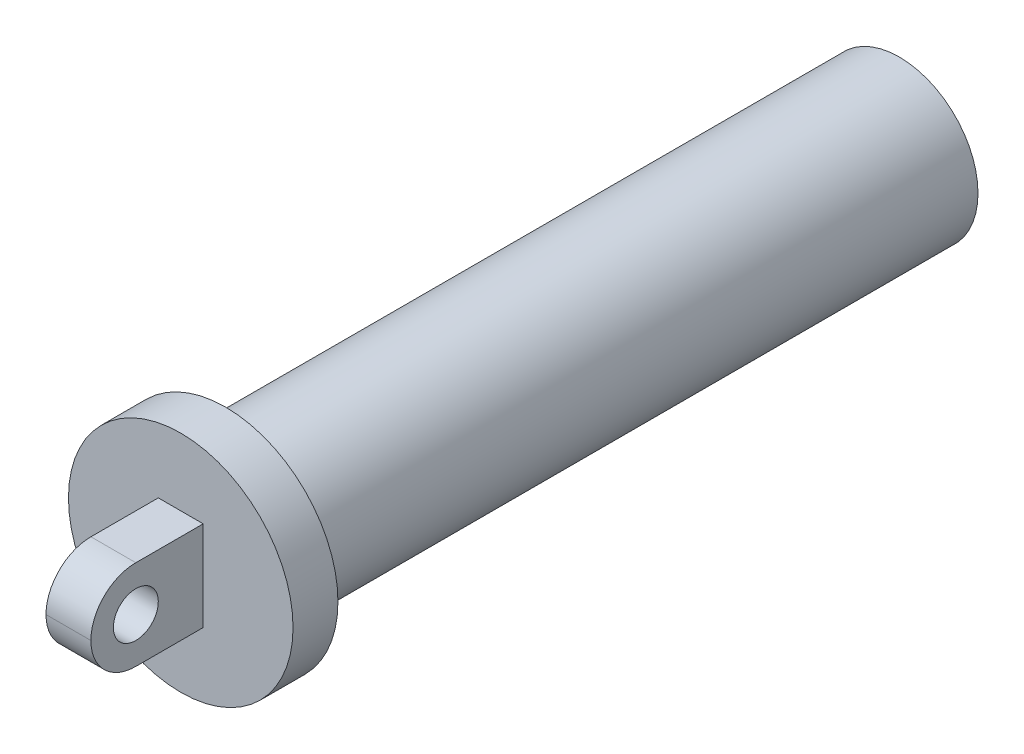
ISO-10303-21;
HEADER;
FILE_DESCRIPTION(('STEP AP214'),'2;1');
FILE_NAME('part.step','',(''),(''),'','','');
FILE_SCHEMA(('AUTOMOTIVE_DESIGN { 1 0 10303 214 1 1 1 1 }'));
ENDSEC;
DATA;
#1=APPLICATION_CONTEXT('core data for automotive mechanical design processes');
#2=APPLICATION_PROTOCOL_DEFINITION('international standard','automotive_design',2000,#1);
#3=PRODUCT_CONTEXT('',#1,'mechanical');
#4=PRODUCT('Part','Part','',(#3));
#5=PRODUCT_RELATED_PRODUCT_CATEGORY('part','',(#4));
#6=PRODUCT_DEFINITION_FORMATION('','',#4);
#7=PRODUCT_DEFINITION_CONTEXT('part definition',#1,'design');
#8=PRODUCT_DEFINITION('design','',#6,#7);
#9=PRODUCT_DEFINITION_SHAPE('','',#8);
#10=(LENGTH_UNIT() NAMED_UNIT(*) SI_UNIT(.MILLI.,.METRE.));
#11=(NAMED_UNIT(*) PLANE_ANGLE_UNIT() SI_UNIT($,.RADIAN.));
#12=(NAMED_UNIT(*) SI_UNIT($,.STERADIAN.) SOLID_ANGLE_UNIT());
#13=UNCERTAINTY_MEASURE_WITH_UNIT(LENGTH_MEASURE(1.E-05),#10,'distance_accuracy_value','');
#14=(GEOMETRIC_REPRESENTATION_CONTEXT(3) GLOBAL_UNCERTAINTY_ASSIGNED_CONTEXT((#13)) GLOBAL_UNIT_ASSIGNED_CONTEXT((#10,
#11,#12)) REPRESENTATION_CONTEXT('',''));
#15=CARTESIAN_POINT('',(0.,0.,0.));
#16=DIRECTION('',(0.,0.,1.));
#17=DIRECTION('',(1.,0.,0.));
#18=AXIS2_PLACEMENT_3D('',#15,#16,#17);
#19=CARTESIAN_POINT('',(0.,0.,10.));
#20=DIRECTION('',(0.,0.,-1.));
#21=DIRECTION('',(-1.,0.,0.));
#22=AXIS2_PLACEMENT_3D('',#19,#20,#21);
#23=CYLINDRICAL_SURFACE('',#22,25.);
#24=CARTESIAN_POINT('',(0.,0.,10.));
#25=DIRECTION('',(0.,0.,1.));
#26=DIRECTION('',(1.,0.,0.));
#27=AXIS2_PLACEMENT_3D('',#24,#25,#26);
#28=CIRCLE('',#27,25.);
#29=CARTESIAN_POINT('',(25.,0.,10.));
#30=VERTEX_POINT('',#29);
#31=EDGE_CURVE('E130',#30,#30,#28,.T.);
#32=ORIENTED_EDGE('',*,*,#31,.F.);
#33=EDGE_LOOP('',(#32));
#34=FACE_BOUND('',#33,.T.);
#35=CARTESIAN_POINT('',(0.,0.,0.));
#36=DIRECTION('',(0.,0.,1.));
#37=DIRECTION('',(1.,0.,0.));
#38=AXIS2_PLACEMENT_3D('',#35,#36,#37);
#39=CIRCLE('',#38,25.);
#40=CARTESIAN_POINT('',(25.,0.,0.));
#41=VERTEX_POINT('',#40);
#42=EDGE_CURVE('E129',#41,#41,#39,.T.);
#43=ORIENTED_EDGE('',*,*,#42,.T.);
#44=EDGE_LOOP('',(#43));
#45=FACE_BOUND('',#44,.T.);
#46=ADVANCED_FACE('F43',(#34,#45),#23,.T.);
#47=CARTESIAN_POINT('',(0.,0.,10.));
#48=DIRECTION('',(0.,0.,1.));
#49=DIRECTION('',(1.,0.,0.));
#50=AXIS2_PLACEMENT_3D('',#47,#48,#49);
#51=PLANE('',#50);
#52=DIRECTION('',(0.,1.,0.));
#53=VECTOR('',#52,1.);
#54=CARTESIAN_POINT('',(5.,10.,10.));
#55=LINE('',#54,#53);
#56=CARTESIAN_POINT('',(5.,-10.,10.));
#57=VERTEX_POINT('',#56);
#58=CARTESIAN_POINT('',(5.,10.,10.));
#59=VERTEX_POINT('',#58);
#60=EDGE_CURVE('E113',#57,#59,#55,.T.);
#61=ORIENTED_EDGE('',*,*,#60,.F.);
#62=DIRECTION('',(1.,0.,0.));
#63=VECTOR('',#62,1.);
#64=CARTESIAN_POINT('',(-5.,-10.,10.));
#65=LINE('',#64,#63);
#66=CARTESIAN_POINT('',(-5.,-10.,10.));
#67=VERTEX_POINT('',#66);
#68=EDGE_CURVE('E107',#67,#57,#65,.T.);
#69=ORIENTED_EDGE('',*,*,#68,.F.);
#70=DIRECTION('',(0.,-1.,0.));
#71=VECTOR('',#70,1.);
#72=CARTESIAN_POINT('',(-5.,10.,10.));
#73=LINE('',#72,#71);
#74=CARTESIAN_POINT('',(-5.,10.,10.));
#75=VERTEX_POINT('',#74);
#76=EDGE_CURVE('E90',#75,#67,#73,.T.);
#77=ORIENTED_EDGE('',*,*,#76,.F.);
#78=DIRECTION('',(-1.,0.,0.));
#79=VECTOR('',#78,1.);
#80=CARTESIAN_POINT('',(-5.,10.,10.));
#81=LINE('',#80,#79);
#82=EDGE_CURVE('E104',#59,#75,#81,.T.);
#83=ORIENTED_EDGE('',*,*,#82,.F.);
#84=EDGE_LOOP('',(#61,#69,#77,#83));
#85=FACE_BOUND('',#84,.T.);
#86=ORIENTED_EDGE('',*,*,#31,.T.);
#87=EDGE_LOOP('',(#86));
#88=FACE_BOUND('',#87,.T.);
#89=ADVANCED_FACE('F102',(#85,#88),#51,.T.);
#90=CARTESIAN_POINT('',(0.,0.,0.));
#91=DIRECTION('',(0.,0.,1.));
#92=DIRECTION('',(1.,0.,0.));
#93=AXIS2_PLACEMENT_3D('',#90,#91,#92);
#94=PLANE('',#93);
#95=CARTESIAN_POINT('',(0.,0.,0.));
#96=DIRECTION('',(0.,0.,1.));
#97=DIRECTION('',(1.,0.,0.));
#98=AXIS2_PLACEMENT_3D('',#95,#96,#97);
#99=CIRCLE('',#98,17.5);
#100=CARTESIAN_POINT('',(17.5,0.,0.));
#101=VERTEX_POINT('',#100);
#102=EDGE_CURVE('E11',#101,#101,#99,.F.);
#103=ORIENTED_EDGE('',*,*,#102,.F.);
#104=EDGE_LOOP('',(#103));
#105=FACE_BOUND('',#104,.T.);
#106=ORIENTED_EDGE('',*,*,#42,.F.);
#107=EDGE_LOOP('',(#106));
#108=FACE_BOUND('',#107,.T.);
#109=ADVANCED_FACE('F201',(#105,#108),#94,.F.);
#110=CARTESIAN_POINT('',(5.,10.,35.));
#111=DIRECTION('',(-1.,0.,0.));
#112=DIRECTION('',(0.,-1.,0.));
#113=AXIS2_PLACEMENT_3D('',#110,#111,#112);
#114=PLANE('',#113);
#115=CARTESIAN_POINT('',(5.,0.,25.));
#116=DIRECTION('',(-1.,0.,0.));
#117=DIRECTION('',(0.,-1.,0.));
#118=AXIS2_PLACEMENT_3D('',#115,#116,#117);
#119=CIRCLE('',#118,5.);
#120=CARTESIAN_POINT('',(5.,-4.99999999999999,25.));
#121=VERTEX_POINT('',#120);
#122=EDGE_CURVE('E116',#121,#121,#119,.T.);
#123=ORIENTED_EDGE('',*,*,#122,.T.);
#124=EDGE_LOOP('',(#123));
#125=FACE_BOUND('',#124,.T.);
#126=CARTESIAN_POINT('',(5.,0.,25.));
#127=DIRECTION('',(-1.,0.,0.));
#128=DIRECTION('',(0.,-1.,0.));
#129=AXIS2_PLACEMENT_3D('',#126,#127,#128);
#130=CIRCLE('',#129,10.);
#131=CARTESIAN_POINT('',(5.,10.,25.));
#132=VERTEX_POINT('',#131);
#133=CARTESIAN_POINT('',(5.,0.,35.));
#134=VERTEX_POINT('',#133);
#135=EDGE_CURVE('E134',#132,#134,#130,.F.);
#136=ORIENTED_EDGE('',*,*,#135,.T.);
#137=CARTESIAN_POINT('',(5.,0.,25.));
#138=DIRECTION('',(-1.,0.,0.));
#139=DIRECTION('',(0.,-1.,0.));
#140=AXIS2_PLACEMENT_3D('',#137,#138,#139);
#141=CIRCLE('',#140,10.);
#142=CARTESIAN_POINT('',(5.,-10.,25.));
#143=VERTEX_POINT('',#142);
#144=EDGE_CURVE('E140',#134,#143,#141,.F.);
#145=ORIENTED_EDGE('',*,*,#144,.T.);
#146=DIRECTION('',(0.,0.,-1.));
#147=VECTOR('',#146,1.);
#148=CARTESIAN_POINT('',(5.,-10.,35.));
#149=LINE('',#148,#147);
#150=EDGE_CURVE('E122',#143,#57,#149,.T.);
#151=ORIENTED_EDGE('',*,*,#150,.T.);
#152=ORIENTED_EDGE('',*,*,#60,.T.);
#153=DIRECTION('',(0.,0.,-1.));
#154=VECTOR('',#153,1.);
#155=CARTESIAN_POINT('',(5.,10.,35.));
#156=LINE('',#155,#154);
#157=EDGE_CURVE('E95',#132,#59,#156,.T.);
#158=ORIENTED_EDGE('',*,*,#157,.F.);
#159=EDGE_LOOP('',(#136,#145,#151,#152,#158));
#160=FACE_BOUND('',#159,.T.);
#161=ADVANCED_FACE('F178',(#125,#160),#114,.F.);
#162=CARTESIAN_POINT('',(-5.,10.,35.));
#163=DIRECTION('',(0.,-1.,0.));
#164=DIRECTION('',(0.,0.,-1.));
#165=AXIS2_PLACEMENT_3D('',#162,#163,#164);
#166=PLANE('',#165);
#167=DIRECTION('',(0.,0.,-1.));
#168=VECTOR('',#167,1.);
#169=CARTESIAN_POINT('',(-5.,10.,35.));
#170=LINE('',#169,#168);
#171=CARTESIAN_POINT('',(-5.,10.,25.));
#172=VERTEX_POINT('',#171);
#173=EDGE_CURVE('E87',#172,#75,#170,.T.);
#174=ORIENTED_EDGE('',*,*,#173,.F.);
#175=DIRECTION('',(-1.,0.,0.));
#176=VECTOR('',#175,1.);
#177=CARTESIAN_POINT('',(5.,10.,25.));
#178=LINE('',#177,#176);
#179=EDGE_CURVE('E52',#172,#132,#178,.F.);
#180=ORIENTED_EDGE('',*,*,#179,.T.);
#181=ORIENTED_EDGE('',*,*,#157,.T.);
#182=ORIENTED_EDGE('',*,*,#82,.T.);
#183=EDGE_LOOP('',(#174,#180,#181,#182));
#184=FACE_BOUND('',#183,.T.);
#185=ADVANCED_FACE('F110',(#184),#166,.F.);
#186=CARTESIAN_POINT('',(-5.,10.,35.));
#187=DIRECTION('',(1.,0.,0.));
#188=DIRECTION('',(0.,1.,0.));
#189=AXIS2_PLACEMENT_3D('',#186,#187,#188);
#190=PLANE('',#189);
#191=CARTESIAN_POINT('',(-5.,0.,25.));
#192=DIRECTION('',(-1.,0.,0.));
#193=DIRECTION('',(0.,-1.,0.));
#194=AXIS2_PLACEMENT_3D('',#191,#192,#193);
#195=CIRCLE('',#194,5.);
#196=CARTESIAN_POINT('',(-5.,-5.,25.));
#197=VERTEX_POINT('',#196);
#198=EDGE_CURVE('E155',#197,#197,#195,.T.);
#199=ORIENTED_EDGE('',*,*,#198,.F.);
#200=EDGE_LOOP('',(#199));
#201=FACE_BOUND('',#200,.T.);
#202=DIRECTION('',(0.,0.,-1.));
#203=VECTOR('',#202,1.);
#204=CARTESIAN_POINT('',(-5.,-10.,35.));
#205=LINE('',#204,#203);
#206=CARTESIAN_POINT('',(-5.,-10.,25.));
#207=VERTEX_POINT('',#206);
#208=EDGE_CURVE('E96',#207,#67,#205,.T.);
#209=ORIENTED_EDGE('',*,*,#208,.F.);
#210=CARTESIAN_POINT('',(-5.,0.,25.));
#211=DIRECTION('',(1.,0.,0.));
#212=DIRECTION('',(0.,1.,0.));
#213=AXIS2_PLACEMENT_3D('',#210,#211,#212);
#214=CIRCLE('',#213,10.);
#215=CARTESIAN_POINT('',(-5.,0.,35.));
#216=VERTEX_POINT('',#215);
#217=EDGE_CURVE('E64',#207,#216,#214,.F.);
#218=ORIENTED_EDGE('',*,*,#217,.T.);
#219=CARTESIAN_POINT('',(-5.,0.,25.));
#220=DIRECTION('',(1.,0.,0.));
#221=DIRECTION('',(0.,1.,0.));
#222=AXIS2_PLACEMENT_3D('',#219,#220,#221);
#223=CIRCLE('',#222,10.);
#224=EDGE_CURVE('E59',#216,#172,#223,.F.);
#225=ORIENTED_EDGE('',*,*,#224,.T.);
#226=ORIENTED_EDGE('',*,*,#173,.T.);
#227=ORIENTED_EDGE('',*,*,#76,.T.);
#228=EDGE_LOOP('',(#209,#218,#225,#226,#227));
#229=FACE_BOUND('',#228,.T.);
#230=ADVANCED_FACE('F89',(#201,#229),#190,.F.);
#231=CARTESIAN_POINT('',(-5.,-10.,35.));
#232=DIRECTION('',(0.,1.,0.));
#233=DIRECTION('',(0.,0.,1.));
#234=AXIS2_PLACEMENT_3D('',#231,#232,#233);
#235=PLANE('',#234);
#236=ORIENTED_EDGE('',*,*,#150,.F.);
#237=DIRECTION('',(1.,0.,0.));
#238=VECTOR('',#237,1.);
#239=CARTESIAN_POINT('',(-5.,-10.,25.));
#240=LINE('',#239,#238);
#241=EDGE_CURVE('E143',#143,#207,#240,.F.);
#242=ORIENTED_EDGE('',*,*,#241,.T.);
#243=ORIENTED_EDGE('',*,*,#208,.T.);
#244=ORIENTED_EDGE('',*,*,#68,.T.);
#245=EDGE_LOOP('',(#236,#242,#243,#244));
#246=FACE_BOUND('',#245,.T.);
#247=ADVANCED_FACE('F183',(#246),#235,.F.);
#248=CARTESIAN_POINT('',(15.,0.,25.));
#249=DIRECTION('',(-1.,0.,0.));
#250=DIRECTION('',(0.,-1.,0.));
#251=AXIS2_PLACEMENT_3D('',#248,#249,#250);
#252=CYLINDRICAL_SURFACE('',#251,5.);
#253=ORIENTED_EDGE('',*,*,#198,.T.);
#254=EDGE_LOOP('',(#253));
#255=FACE_BOUND('',#254,.T.);
#256=ORIENTED_EDGE('',*,*,#122,.F.);
#257=EDGE_LOOP('',(#256));
#258=FACE_BOUND('',#257,.T.);
#259=ADVANCED_FACE('F181',(#255,#258),#252,.F.);
#260=CARTESIAN_POINT('',(0.,0.,25.));
#261=DIRECTION('',(1.,0.,0.));
#262=DIRECTION('',(0.,0.,-1.));
#263=AXIS2_PLACEMENT_3D('',#260,#261,#262);
#264=CYLINDRICAL_SURFACE('',#263,10.);
#265=ORIENTED_EDGE('',*,*,#179,.F.);
#266=ORIENTED_EDGE('',*,*,#224,.F.);
#267=DIRECTION('',(-1.,0.,0.));
#268=VECTOR('',#267,1.);
#269=CARTESIAN_POINT('',(-5.,0.,35.));
#270=LINE('',#269,#268);
#271=EDGE_CURVE('E152',#134,#216,#270,.T.);
#272=ORIENTED_EDGE('',*,*,#271,.F.);
#273=ORIENTED_EDGE('',*,*,#135,.F.);
#274=EDGE_LOOP('',(#265,#266,#272,#273));
#275=FACE_BOUND('',#274,.T.);
#276=ADVANCED_FACE('F45',(#275),#264,.T.);
#277=CARTESIAN_POINT('',(0.,0.,25.));
#278=DIRECTION('',(-1.,0.,0.));
#279=DIRECTION('',(0.,0.,1.));
#280=AXIS2_PLACEMENT_3D('',#277,#278,#279);
#281=CYLINDRICAL_SURFACE('',#280,10.);
#282=ORIENTED_EDGE('',*,*,#217,.F.);
#283=ORIENTED_EDGE('',*,*,#241,.F.);
#284=ORIENTED_EDGE('',*,*,#144,.F.);
#285=ORIENTED_EDGE('',*,*,#271,.T.);
#286=EDGE_LOOP('',(#282,#283,#284,#285));
#287=FACE_BOUND('',#286,.T.);
#288=ADVANCED_FACE('F190',(#287),#281,.T.);
#289=CARTESIAN_POINT('',(0.,0.,-150.));
#290=DIRECTION('',(0.,0.,-1.));
#291=DIRECTION('',(-1.,0.,0.));
#292=AXIS2_PLACEMENT_3D('',#289,#290,#291);
#293=PLANE('',#292);
#294=CARTESIAN_POINT('',(0.,0.,-150.));
#295=DIRECTION('',(0.,0.,-1.));
#296=DIRECTION('',(-1.,0.,0.));
#297=AXIS2_PLACEMENT_3D('',#294,#295,#296);
#298=CIRCLE('',#297,17.5);
#299=CARTESIAN_POINT('',(-17.5,0.,-150.));
#300=VERTEX_POINT('',#299);
#301=EDGE_CURVE('E156',#300,#300,#298,.T.);
#302=ORIENTED_EDGE('',*,*,#301,.T.);
#303=EDGE_LOOP('',(#302));
#304=FACE_BOUND('',#303,.T.);
#305=CARTESIAN_POINT('',(0.,0.,-150.));
#306=DIRECTION('',(0.,0.,-1.));
#307=DIRECTION('',(-1.,0.,0.));
#308=AXIS2_PLACEMENT_3D('',#305,#306,#307);
#309=CIRCLE('',#308,12.5);
#310=CARTESIAN_POINT('',(-12.5,0.,-150.));
#311=VERTEX_POINT('',#310);
#312=EDGE_CURVE('E165',#311,#311,#309,.T.);
#313=ORIENTED_EDGE('',*,*,#312,.F.);
#314=EDGE_LOOP('',(#313));
#315=FACE_BOUND('',#314,.T.);
#316=ADVANCED_FACE('F207',(#304,#315),#293,.T.);
#317=CARTESIAN_POINT('',(0.,0.,-150.));
#318=DIRECTION('',(0.,0.,1.));
#319=DIRECTION('',(1.,0.,0.));
#320=AXIS2_PLACEMENT_3D('',#317,#318,#319);
#321=CYLINDRICAL_SURFACE('',#320,17.5);
#322=ORIENTED_EDGE('',*,*,#301,.F.);
#323=EDGE_LOOP('',(#322));
#324=FACE_BOUND('',#323,.T.);
#325=ORIENTED_EDGE('',*,*,#102,.T.);
#326=EDGE_LOOP('',(#325));
#327=FACE_BOUND('',#326,.T.);
#328=ADVANCED_FACE('F211',(#324,#327),#321,.T.);
#329=CARTESIAN_POINT('',(0.,0.,-150.));
#330=DIRECTION('',(0.,0.,1.));
#331=DIRECTION('',(1.,0.,0.));
#332=AXIS2_PLACEMENT_3D('',#329,#330,#331);
#333=CYLINDRICAL_SURFACE('',#332,12.5);
#334=ORIENTED_EDGE('',*,*,#312,.T.);
#335=EDGE_LOOP('',(#334));
#336=FACE_BOUND('',#335,.T.);
#337=CARTESIAN_POINT('',(0.,0.,0.));
#338=DIRECTION('',(0.,0.,-1.));
#339=DIRECTION('',(-1.,0.,0.));
#340=AXIS2_PLACEMENT_3D('',#337,#338,#339);
#341=CIRCLE('',#340,12.5);
#342=CARTESIAN_POINT('',(-12.5,0.,0.));
#343=VERTEX_POINT('',#342);
#344=EDGE_CURVE('E171',#343,#343,#341,.T.);
#345=ORIENTED_EDGE('',*,*,#344,.F.);
#346=EDGE_LOOP('',(#345));
#347=FACE_BOUND('',#346,.T.);
#348=ADVANCED_FACE('F277',(#336,#347),#333,.F.);
#349=ORIENTED_EDGE('',*,*,#344,.T.);
#350=EDGE_LOOP('',(#349));
#351=FACE_BOUND('',#350,.T.);
#352=ADVANCED_FACE('F224',(#351),#94,.F.);
#353=CLOSED_SHELL('',(#46,#89,#109,#161,#185,#230,#247,#259,#276,#288,#316,#328,#348,#352));
#354=MANIFOLD_SOLID_BREP('B2',#353);
#355=ADVANCED_BREP_SHAPE_REPRESENTATION('',(#18,#354),#14);
#356=SHAPE_DEFINITION_REPRESENTATION(#9,#355);
ENDSEC;
END-ISO-10303-21;
